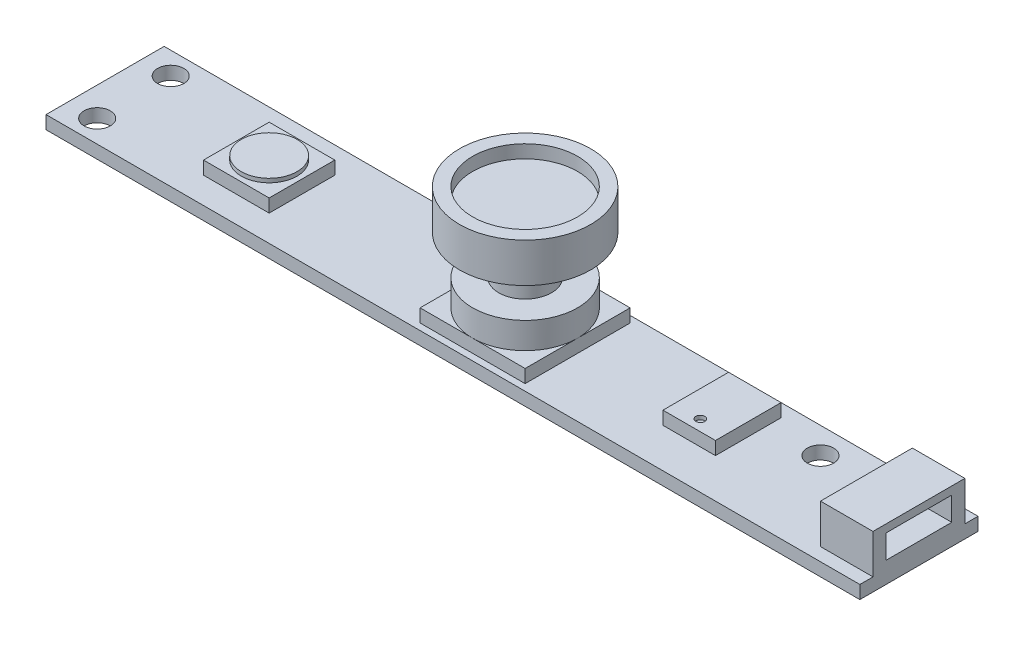
ISO-10303-21;
HEADER;
FILE_DESCRIPTION(('STEP AP214'),'2;1');
FILE_NAME('part.step','',(''),(''),'','','');
FILE_SCHEMA(('AUTOMOTIVE_DESIGN { 1 0 10303 214 1 1 1 1 }'));
ENDSEC;
DATA;
#1=APPLICATION_CONTEXT('core data for automotive mechanical design processes');
#2=APPLICATION_PROTOCOL_DEFINITION('international standard','automotive_design',2000,#1);
#3=PRODUCT_CONTEXT('',#1,'mechanical');
#4=PRODUCT('Part','Part','',(#3));
#5=PRODUCT_RELATED_PRODUCT_CATEGORY('part','',(#4));
#6=PRODUCT_DEFINITION_FORMATION('','',#4);
#7=PRODUCT_DEFINITION_CONTEXT('part definition',#1,'design');
#8=PRODUCT_DEFINITION('design','',#6,#7);
#9=PRODUCT_DEFINITION_SHAPE('','',#8);
#10=(LENGTH_UNIT() NAMED_UNIT(*) SI_UNIT(.MILLI.,.METRE.));
#11=(NAMED_UNIT(*) PLANE_ANGLE_UNIT() SI_UNIT($,.RADIAN.));
#12=(NAMED_UNIT(*) SI_UNIT($,.STERADIAN.) SOLID_ANGLE_UNIT());
#13=UNCERTAINTY_MEASURE_WITH_UNIT(LENGTH_MEASURE(1.E-05),#10,'distance_accuracy_value','');
#14=(GEOMETRIC_REPRESENTATION_CONTEXT(3) GLOBAL_UNCERTAINTY_ASSIGNED_CONTEXT((#13)) GLOBAL_UNIT_ASSIGNED_CONTEXT((#10,
#11,#12)) REPRESENTATION_CONTEXT('',''));
#15=CARTESIAN_POINT('',(0.,0.,0.));
#16=DIRECTION('',(0.,0.,1.));
#17=DIRECTION('',(1.,0.,0.));
#18=AXIS2_PLACEMENT_3D('',#15,#16,#17);
#19=CARTESIAN_POINT('',(0.,2.,0.));
#20=DIRECTION('',(0.,1.,0.));
#21=DIRECTION('',(0.,0.,1.));
#22=AXIS2_PLACEMENT_3D('',#19,#20,#21);
#23=PLANE('',#22);
#24=CARTESIAN_POINT('',(32.,2.,-4.5));
#25=DIRECTION('',(0.,1.,0.));
#26=DIRECTION('',(0.,0.,1.));
#27=AXIS2_PLACEMENT_3D('',#24,#25,#26);
#28=CIRCLE('',#27,4.);
#29=CARTESIAN_POINT('',(32.,2.,-0.500000000000003));
#30=VERTEX_POINT('',#29);
#31=CARTESIAN_POINT('',(36.,2.,-4.5));
#32=VERTEX_POINT('',#31);
#33=EDGE_CURVE('E234',#30,#32,#28,.T.);
#34=ORIENTED_EDGE('',*,*,#33,.F.);
#35=DIRECTION('',(1.,0.,0.));
#36=VECTOR('',#35,1.);
#37=CARTESIAN_POINT('',(0.,2.,-0.500000000000003));
#38=LINE('',#37,#36);
#39=CARTESIAN_POINT('',(36.,2.,-0.500000000000003));
#40=VERTEX_POINT('',#39);
#41=EDGE_CURVE('E221',#30,#40,#38,.T.);
#42=ORIENTED_EDGE('',*,*,#41,.T.);
#43=DIRECTION('',(0.,0.,-1.));
#44=VECTOR('',#43,1.);
#45=CARTESIAN_POINT('',(36.,2.,0.));
#46=LINE('',#45,#44);
#47=EDGE_CURVE('E235',#40,#32,#46,.T.);
#48=ORIENTED_EDGE('',*,*,#47,.T.);
#49=EDGE_LOOP('',(#34,#42,#48));
#50=FACE_BOUND('',#49,.T.);
#51=ADVANCED_FACE('F40',(#50),#23,.T.);
#52=CARTESIAN_POINT('',(32.,2.,-8.5));
#53=VERTEX_POINT('',#52);
#54=EDGE_CURVE('E49',#32,#53,#28,.T.);
#55=ORIENTED_EDGE('',*,*,#54,.F.);
#56=CARTESIAN_POINT('',(36.,2.,-8.5));
#57=VERTEX_POINT('',#56);
#58=EDGE_CURVE('E220',#32,#57,#46,.T.);
#59=ORIENTED_EDGE('',*,*,#58,.T.);
#60=DIRECTION('',(-1.,0.,0.));
#61=VECTOR('',#60,1.);
#62=CARTESIAN_POINT('',(0.,2.,-8.49999999999999));
#63=LINE('',#62,#61);
#64=EDGE_CURVE('E248',#57,#53,#63,.T.);
#65=ORIENTED_EDGE('',*,*,#64,.T.);
#66=EDGE_LOOP('',(#55,#59,#65));
#67=FACE_BOUND('',#66,.T.);
#68=ADVANCED_FACE('F496',(#67),#23,.T.);
#69=CARTESIAN_POINT('',(28.,2.,-4.5));
#70=VERTEX_POINT('',#69);
#71=EDGE_CURVE('E242',#53,#70,#28,.T.);
#72=ORIENTED_EDGE('',*,*,#71,.F.);
#73=CARTESIAN_POINT('',(28.,2.,-8.5));
#74=VERTEX_POINT('',#73);
#75=EDGE_CURVE('E250',#53,#74,#63,.T.);
#76=ORIENTED_EDGE('',*,*,#75,.T.);
#77=DIRECTION('',(0.,0.,1.));
#78=VECTOR('',#77,1.);
#79=CARTESIAN_POINT('',(28.,2.,0.));
#80=LINE('',#79,#78);
#81=EDGE_CURVE('E232',#74,#70,#80,.T.);
#82=ORIENTED_EDGE('',*,*,#81,.T.);
#83=EDGE_LOOP('',(#72,#76,#82));
#84=FACE_BOUND('',#83,.T.);
#85=ADVANCED_FACE('F501',(#84),#23,.T.);
#86=CARTESIAN_POINT('',(0.,1.,0.));
#87=DIRECTION('',(0.,-1.,0.));
#88=DIRECTION('',(0.,0.,-1.));
#89=AXIS2_PLACEMENT_3D('',#86,#87,#88);
#90=PLANE('',#89);
#91=DIRECTION('',(-1.,0.,0.));
#92=VECTOR('',#91,1.);
#93=CARTESIAN_POINT('',(0.,1.,-8.));
#94=LINE('',#93,#92);
#95=CARTESIAN_POINT('',(48.,1.,-8.));
#96=VERTEX_POINT('',#95);
#97=CARTESIAN_POINT('',(44.,1.,-8.));
#98=VERTEX_POINT('',#97);
#99=EDGE_CURVE('E310',#96,#98,#94,.T.);
#100=ORIENTED_EDGE('',*,*,#99,.F.);
#101=DIRECTION('',(0.,0.,1.));
#102=VECTOR('',#101,1.);
#103=CARTESIAN_POINT('',(48.,1.,0.));
#104=LINE('',#103,#102);
#105=CARTESIAN_POINT('',(48.,1.,-3.));
#106=VERTEX_POINT('',#105);
#107=EDGE_CURVE('E315',#96,#106,#104,.T.);
#108=ORIENTED_EDGE('',*,*,#107,.T.);
#109=DIRECTION('',(-1.,0.,0.));
#110=VECTOR('',#109,1.);
#111=CARTESIAN_POINT('',(0.,1.,-3.));
#112=LINE('',#111,#110);
#113=CARTESIAN_POINT('',(44.,1.,-3.));
#114=VERTEX_POINT('',#113);
#115=EDGE_CURVE('E329',#106,#114,#112,.T.);
#116=ORIENTED_EDGE('',*,*,#115,.T.);
#117=DIRECTION('',(0.,0.,1.));
#118=VECTOR('',#117,1.);
#119=CARTESIAN_POINT('',(44.,1.,0.));
#120=LINE('',#119,#118);
#121=EDGE_CURVE('E326',#98,#114,#120,.T.);
#122=ORIENTED_EDGE('',*,*,#121,.F.);
#123=EDGE_LOOP('',(#100,#108,#116,#122));
#124=FACE_BOUND('',#123,.T.);
#125=CARTESIAN_POINT('',(52.,1.,-7.));
#126=DIRECTION('',(0.,1.,0.));
#127=DIRECTION('',(0.,0.,1.));
#128=AXIS2_PLACEMENT_3D('',#125,#126,#127);
#129=CIRCLE('',#128,0.999999999999998);
#130=CARTESIAN_POINT('',(52.,1.,-6.));
#131=VERTEX_POINT('',#130);
#132=EDGE_CURVE('E342',#131,#131,#129,.T.);
#133=ORIENTED_EDGE('',*,*,#132,.F.);
#134=EDGE_LOOP('',(#133));
#135=FACE_BOUND('',#134,.T.);
#136=CARTESIAN_POINT('',(2.2,1.,-1.7));
#137=DIRECTION('',(0.,1.,0.));
#138=DIRECTION('',(0.,0.,1.));
#139=AXIS2_PLACEMENT_3D('',#136,#137,#138);
#140=CIRCLE('',#139,1.);
#141=CARTESIAN_POINT('',(2.2,1.,-0.699999999999999));
#142=VERTEX_POINT('',#141);
#143=EDGE_CURVE('E347',#142,#142,#140,.T.);
#144=ORIENTED_EDGE('',*,*,#143,.F.);
#145=EDGE_LOOP('',(#144));
#146=FACE_BOUND('',#145,.T.);
#147=CARTESIAN_POINT('',(2.2,1.,-7.3));
#148=DIRECTION('',(0.,1.,0.));
#149=DIRECTION('',(0.,0.,1.));
#150=AXIS2_PLACEMENT_3D('',#147,#148,#149);
#151=CIRCLE('',#150,1.);
#152=CARTESIAN_POINT('',(2.2,1.,-6.3));
#153=VERTEX_POINT('',#152);
#154=EDGE_CURVE('E346',#153,#153,#151,.T.);
#155=ORIENTED_EDGE('',*,*,#154,.F.);
#156=EDGE_LOOP('',(#155));
#157=FACE_BOUND('',#156,.T.);
#158=DIRECTION('',(1.,0.,0.));
#159=VECTOR('',#158,1.);
#160=CARTESIAN_POINT('',(58.,1.,-1.));
#161=LINE('',#160,#159);
#162=CARTESIAN_POINT('',(58.,1.,-1.));
#163=VERTEX_POINT('',#162);
#164=CARTESIAN_POINT('',(62.,1.,-1.));
#165=VERTEX_POINT('',#164);
#166=EDGE_CURVE('E396',#163,#165,#161,.T.);
#167=ORIENTED_EDGE('',*,*,#166,.F.);
#168=DIRECTION('',(0.,0.,1.));
#169=VECTOR('',#168,1.);
#170=CARTESIAN_POINT('',(58.,1.,-8.));
#171=LINE('',#170,#169);
#172=CARTESIAN_POINT('',(58.,1.,-8.));
#173=VERTEX_POINT('',#172);
#174=EDGE_CURVE('E405',#173,#163,#171,.T.);
#175=ORIENTED_EDGE('',*,*,#174,.F.);
#176=DIRECTION('',(-1.,0.,0.));
#177=VECTOR('',#176,1.);
#178=CARTESIAN_POINT('',(62.,1.,-8.));
#179=LINE('',#178,#177);
#180=CARTESIAN_POINT('',(62.,1.,-8.));
#181=VERTEX_POINT('',#180);
#182=EDGE_CURVE('E386',#181,#173,#179,.T.);
#183=ORIENTED_EDGE('',*,*,#182,.F.);
#184=DIRECTION('',(0.,0.,-1.));
#185=VECTOR('',#184,1.);
#186=CARTESIAN_POINT('',(62.,1.,0.));
#187=LINE('',#186,#185);
#188=CARTESIAN_POINT('',(62.,1.,-9.));
#189=VERTEX_POINT('',#188);
#190=EDGE_CURVE('E428',#181,#189,#187,.T.);
#191=ORIENTED_EDGE('',*,*,#190,.T.);
#192=DIRECTION('',(-1.,0.,0.));
#193=VECTOR('',#192,1.);
#194=CARTESIAN_POINT('',(0.,1.,-9.));
#195=LINE('',#194,#193);
#196=CARTESIAN_POINT('',(0.,1.,-9.));
#197=VERTEX_POINT('',#196);
#198=EDGE_CURVE('E431',#189,#197,#195,.T.);
#199=ORIENTED_EDGE('',*,*,#198,.T.);
#200=DIRECTION('',(0.,0.,1.));
#201=VECTOR('',#200,1.);
#202=CARTESIAN_POINT('',(0.,1.,0.));
#203=LINE('',#202,#201);
#204=CARTESIAN_POINT('',(0.,1.,0.));
#205=VERTEX_POINT('',#204);
#206=EDGE_CURVE('E422',#197,#205,#203,.T.);
#207=ORIENTED_EDGE('',*,*,#206,.T.);
#208=DIRECTION('',(1.,0.,0.));
#209=VECTOR('',#208,1.);
#210=CARTESIAN_POINT('',(0.,1.,0.));
#211=LINE('',#210,#209);
#212=CARTESIAN_POINT('',(62.,1.,0.));
#213=VERTEX_POINT('',#212);
#214=EDGE_CURVE('E425',#205,#213,#211,.T.);
#215=ORIENTED_EDGE('',*,*,#214,.T.);
#216=EDGE_CURVE('E429',#213,#165,#187,.T.);
#217=ORIENTED_EDGE('',*,*,#216,.T.);
#218=EDGE_LOOP('',(#167,#175,#183,#191,#199,#207,#215,#217));
#219=FACE_BOUND('',#218,.T.);
#220=DIRECTION('',(-1.,0.,0.));
#221=VECTOR('',#220,1.);
#222=CARTESIAN_POINT('',(0.,1.,-2.));
#223=LINE('',#222,#221);
#224=CARTESIAN_POINT('',(15.,1.,-2.));
#225=VERTEX_POINT('',#224);
#226=CARTESIAN_POINT('',(10.,1.,-2.));
#227=VERTEX_POINT('',#226);
#228=EDGE_CURVE('E294',#225,#227,#223,.T.);
#229=ORIENTED_EDGE('',*,*,#228,.T.);
#230=DIRECTION('',(0.,0.,-1.));
#231=VECTOR('',#230,1.);
#232=CARTESIAN_POINT('',(10.,1.,0.));
#233=LINE('',#232,#231);
#234=CARTESIAN_POINT('',(10.,1.,-7.));
#235=VERTEX_POINT('',#234);
#236=EDGE_CURVE('E276',#227,#235,#233,.T.);
#237=ORIENTED_EDGE('',*,*,#236,.T.);
#238=DIRECTION('',(1.,0.,0.));
#239=VECTOR('',#238,1.);
#240=CARTESIAN_POINT('',(0.,1.,-6.99999999999999));
#241=LINE('',#240,#239);
#242=CARTESIAN_POINT('',(15.,1.,-7.));
#243=VERTEX_POINT('',#242);
#244=EDGE_CURVE('E282',#235,#243,#241,.T.);
#245=ORIENTED_EDGE('',*,*,#244,.T.);
#246=DIRECTION('',(0.,0.,1.));
#247=VECTOR('',#246,1.);
#248=CARTESIAN_POINT('',(15.,1.,0.));
#249=LINE('',#248,#247);
#250=EDGE_CURVE('E297',#243,#225,#249,.T.);
#251=ORIENTED_EDGE('',*,*,#250,.T.);
#252=EDGE_LOOP('',(#229,#237,#245,#251));
#253=FACE_BOUND('',#252,.T.);
#254=DIRECTION('',(-1.,0.,0.));
#255=VECTOR('',#254,1.);
#256=CARTESIAN_POINT('',(0.,1.,-8.49999999999999));
#257=LINE('',#256,#255);
#258=CARTESIAN_POINT('',(36.,1.,-8.5));
#259=VERTEX_POINT('',#258);
#260=CARTESIAN_POINT('',(28.,1.,-8.5));
#261=VERTEX_POINT('',#260);
#262=EDGE_CURVE('E255',#259,#261,#257,.T.);
#263=ORIENTED_EDGE('',*,*,#262,.F.);
#264=DIRECTION('',(0.,0.,-1.));
#265=VECTOR('',#264,1.);
#266=CARTESIAN_POINT('',(36.,1.,0.));
#267=LINE('',#266,#265);
#268=CARTESIAN_POINT('',(36.,1.,-0.500000000000003));
#269=VERTEX_POINT('',#268);
#270=EDGE_CURVE('E263',#269,#259,#267,.T.);
#271=ORIENTED_EDGE('',*,*,#270,.F.);
#272=DIRECTION('',(1.,0.,0.));
#273=VECTOR('',#272,1.);
#274=CARTESIAN_POINT('',(0.,1.,-0.500000000000003));
#275=LINE('',#274,#273);
#276=CARTESIAN_POINT('',(28.,1.,-0.500000000000003));
#277=VERTEX_POINT('',#276);
#278=EDGE_CURVE('E261',#277,#269,#275,.T.);
#279=ORIENTED_EDGE('',*,*,#278,.F.);
#280=DIRECTION('',(0.,0.,1.));
#281=VECTOR('',#280,1.);
#282=CARTESIAN_POINT('',(28.,1.,0.));
#283=LINE('',#282,#281);
#284=EDGE_CURVE('E258',#261,#277,#283,.T.);
#285=ORIENTED_EDGE('',*,*,#284,.F.);
#286=EDGE_LOOP('',(#263,#271,#279,#285));
#287=FACE_BOUND('',#286,.T.);
#288=ADVANCED_FACE('F469',(#124,#135,#146,#157,#219,#253,#287),#90,.F.);
#289=CARTESIAN_POINT('',(0.,1.,0.));
#290=DIRECTION('',(1.,0.,0.));
#291=DIRECTION('',(0.,0.,-1.));
#292=AXIS2_PLACEMENT_3D('',#289,#290,#291);
#293=PLANE('',#292);
#294=DIRECTION('',(0.,0.,1.));
#295=VECTOR('',#294,1.);
#296=CARTESIAN_POINT('',(0.,0.,0.));
#297=LINE('',#296,#295);
#298=CARTESIAN_POINT('',(0.,0.,-9.));
#299=VERTEX_POINT('',#298);
#300=CARTESIAN_POINT('',(0.,0.,0.));
#301=VERTEX_POINT('',#300);
#302=EDGE_CURVE('E421',#299,#301,#297,.T.);
#303=ORIENTED_EDGE('',*,*,#302,.T.);
#304=DIRECTION('',(0.,-1.,0.));
#305=VECTOR('',#304,1.);
#306=CARTESIAN_POINT('',(0.,1.,0.));
#307=LINE('',#306,#305);
#308=EDGE_CURVE('E44',#205,#301,#307,.T.);
#309=ORIENTED_EDGE('',*,*,#308,.F.);
#310=ORIENTED_EDGE('',*,*,#206,.F.);
#311=DIRECTION('',(0.,-1.,0.));
#312=VECTOR('',#311,1.);
#313=CARTESIAN_POINT('',(0.,1.,-9.));
#314=LINE('',#313,#312);
#315=EDGE_CURVE('E433',#197,#299,#314,.T.);
#316=ORIENTED_EDGE('',*,*,#315,.T.);
#317=EDGE_LOOP('',(#303,#309,#310,#316));
#318=FACE_BOUND('',#317,.T.);
#319=ADVANCED_FACE('F42',(#318),#293,.F.);
#320=CARTESIAN_POINT('',(0.,1.,0.));
#321=DIRECTION('',(0.,0.,-1.));
#322=DIRECTION('',(-1.,0.,0.));
#323=AXIS2_PLACEMENT_3D('',#320,#321,#322);
#324=PLANE('',#323);
#325=DIRECTION('',(1.,0.,0.));
#326=VECTOR('',#325,1.);
#327=CARTESIAN_POINT('',(0.,0.,0.));
#328=LINE('',#327,#326);
#329=CARTESIAN_POINT('',(62.,0.,0.));
#330=VERTEX_POINT('',#329);
#331=EDGE_CURVE('E436',#301,#330,#328,.T.);
#332=ORIENTED_EDGE('',*,*,#331,.T.);
#333=DIRECTION('',(0.,-1.,0.));
#334=VECTOR('',#333,1.);
#335=CARTESIAN_POINT('',(62.,1.,0.));
#336=LINE('',#335,#334);
#337=EDGE_CURVE('E445',#213,#330,#336,.T.);
#338=ORIENTED_EDGE('',*,*,#337,.F.);
#339=ORIENTED_EDGE('',*,*,#214,.F.);
#340=ORIENTED_EDGE('',*,*,#308,.T.);
#341=EDGE_LOOP('',(#332,#338,#339,#340));
#342=FACE_BOUND('',#341,.T.);
#343=ADVANCED_FACE('F454',(#342),#324,.F.);
#344=CARTESIAN_POINT('',(62.,1.,0.));
#345=DIRECTION('',(-1.,0.,0.));
#346=DIRECTION('',(0.,0.,1.));
#347=AXIS2_PLACEMENT_3D('',#344,#345,#346);
#348=PLANE('',#347);
#349=DIRECTION('',(0.,0.,-1.));
#350=VECTOR('',#349,1.);
#351=CARTESIAN_POINT('',(62.,1.6,-2.));
#352=LINE('',#351,#350);
#353=CARTESIAN_POINT('',(62.,1.6,-2.));
#354=VERTEX_POINT('',#353);
#355=CARTESIAN_POINT('',(62.,1.6,-7.));
#356=VERTEX_POINT('',#355);
#357=EDGE_CURVE('E376',#354,#356,#352,.T.);
#358=ORIENTED_EDGE('',*,*,#357,.F.);
#359=DIRECTION('',(0.,-1.,0.));
#360=VECTOR('',#359,1.);
#361=CARTESIAN_POINT('',(62.,3.4,-2.));
#362=LINE('',#361,#360);
#363=CARTESIAN_POINT('',(62.,3.4,-2.));
#364=VERTEX_POINT('',#363);
#365=EDGE_CURVE('E358',#364,#354,#362,.T.);
#366=ORIENTED_EDGE('',*,*,#365,.F.);
#367=DIRECTION('',(0.,0.,1.));
#368=VECTOR('',#367,1.);
#369=CARTESIAN_POINT('',(62.,3.4,-2.));
#370=LINE('',#369,#368);
#371=CARTESIAN_POINT('',(62.,3.4,-7.));
#372=VERTEX_POINT('',#371);
#373=EDGE_CURVE('E365',#372,#364,#370,.T.);
#374=ORIENTED_EDGE('',*,*,#373,.F.);
#375=DIRECTION('',(0.,1.,0.));
#376=VECTOR('',#375,1.);
#377=CARTESIAN_POINT('',(62.,3.4,-7.));
#378=LINE('',#377,#376);
#379=EDGE_CURVE('E379',#356,#372,#378,.T.);
#380=ORIENTED_EDGE('',*,*,#379,.F.);
#381=EDGE_LOOP('',(#358,#366,#374,#380));
#382=FACE_BOUND('',#381,.T.);
#383=DIRECTION('',(0.,0.,-1.));
#384=VECTOR('',#383,1.);
#385=CARTESIAN_POINT('',(62.,0.,0.));
#386=LINE('',#385,#384);
#387=CARTESIAN_POINT('',(62.,0.,-9.));
#388=VERTEX_POINT('',#387);
#389=EDGE_CURVE('E438',#330,#388,#386,.T.);
#390=ORIENTED_EDGE('',*,*,#389,.T.);
#391=DIRECTION('',(0.,-1.,0.));
#392=VECTOR('',#391,1.);
#393=CARTESIAN_POINT('',(62.,1.,-9.));
#394=LINE('',#393,#392);
#395=EDGE_CURVE('E443',#189,#388,#394,.T.);
#396=ORIENTED_EDGE('',*,*,#395,.F.);
#397=ORIENTED_EDGE('',*,*,#190,.F.);
#398=DIRECTION('',(0.,-1.,0.));
#399=VECTOR('',#398,1.);
#400=CARTESIAN_POINT('',(62.,4.,-8.));
#401=LINE('',#400,#399);
#402=CARTESIAN_POINT('',(62.,4.,-8.));
#403=VERTEX_POINT('',#402);
#404=EDGE_CURVE('E418',#403,#181,#401,.T.);
#405=ORIENTED_EDGE('',*,*,#404,.F.);
#406=DIRECTION('',(0.,0.,-1.));
#407=VECTOR('',#406,1.);
#408=CARTESIAN_POINT('',(62.,4.,-4.5));
#409=LINE('',#408,#407);
#410=CARTESIAN_POINT('',(62.,4.,-1.));
#411=VERTEX_POINT('',#410);
#412=EDGE_CURVE('E393',#411,#403,#409,.T.);
#413=ORIENTED_EDGE('',*,*,#412,.F.);
#414=DIRECTION('',(0.,-1.,0.));
#415=VECTOR('',#414,1.);
#416=CARTESIAN_POINT('',(62.,4.,-1.));
#417=LINE('',#416,#415);
#418=EDGE_CURVE('E402',#411,#165,#417,.T.);
#419=ORIENTED_EDGE('',*,*,#418,.T.);
#420=ORIENTED_EDGE('',*,*,#216,.F.);
#421=ORIENTED_EDGE('',*,*,#337,.T.);
#422=EDGE_LOOP('',(#390,#396,#397,#405,#413,#419,#420,#421));
#423=FACE_BOUND('',#422,.T.);
#424=ADVANCED_FACE('F463',(#382,#423),#348,.F.);
#425=CARTESIAN_POINT('',(0.,1.,-9.));
#426=DIRECTION('',(0.,0.,1.));
#427=DIRECTION('',(1.,0.,0.));
#428=AXIS2_PLACEMENT_3D('',#425,#426,#427);
#429=PLANE('',#428);
#430=DIRECTION('',(-1.,0.,0.));
#431=VECTOR('',#430,1.);
#432=CARTESIAN_POINT('',(0.,0.,-9.));
#433=LINE('',#432,#431);
#434=EDGE_CURVE('E426',#388,#299,#433,.T.);
#435=ORIENTED_EDGE('',*,*,#434,.T.);
#436=ORIENTED_EDGE('',*,*,#315,.F.);
#437=ORIENTED_EDGE('',*,*,#198,.F.);
#438=ORIENTED_EDGE('',*,*,#395,.T.);
#439=EDGE_LOOP('',(#435,#436,#437,#438));
#440=FACE_BOUND('',#439,.T.);
#441=ADVANCED_FACE('F467',(#440),#429,.F.);
#442=CARTESIAN_POINT('',(0.,0.,0.));
#443=DIRECTION('',(0.,-1.,0.));
#444=DIRECTION('',(0.,0.,-1.));
#445=AXIS2_PLACEMENT_3D('',#442,#443,#444);
#446=PLANE('',#445);
#447=CARTESIAN_POINT('',(52.,0.,-7.));
#448=DIRECTION('',(0.,1.,0.));
#449=DIRECTION('',(0.,0.,1.));
#450=AXIS2_PLACEMENT_3D('',#447,#448,#449);
#451=CIRCLE('',#450,0.999999999999998);
#452=CARTESIAN_POINT('',(52.,0.,-6.));
#453=VERTEX_POINT('',#452);
#454=EDGE_CURVE('E350',#453,#453,#451,.T.);
#455=ORIENTED_EDGE('',*,*,#454,.T.);
#456=EDGE_LOOP('',(#455));
#457=FACE_BOUND('',#456,.T.);
#458=CARTESIAN_POINT('',(2.2,0.,-1.7));
#459=DIRECTION('',(0.,1.,0.));
#460=DIRECTION('',(0.,0.,1.));
#461=AXIS2_PLACEMENT_3D('',#458,#459,#460);
#462=CIRCLE('',#461,1.);
#463=CARTESIAN_POINT('',(2.2,0.,-0.699999999999999));
#464=VERTEX_POINT('',#463);
#465=EDGE_CURVE('E343',#464,#464,#462,.T.);
#466=ORIENTED_EDGE('',*,*,#465,.T.);
#467=EDGE_LOOP('',(#466));
#468=FACE_BOUND('',#467,.T.);
#469=CARTESIAN_POINT('',(2.2,0.,-7.3));
#470=DIRECTION('',(0.,1.,0.));
#471=DIRECTION('',(0.,0.,1.));
#472=AXIS2_PLACEMENT_3D('',#469,#470,#471);
#473=CIRCLE('',#472,1.);
#474=CARTESIAN_POINT('',(2.2,0.,-6.3));
#475=VERTEX_POINT('',#474);
#476=EDGE_CURVE('E355',#475,#475,#473,.T.);
#477=ORIENTED_EDGE('',*,*,#476,.T.);
#478=EDGE_LOOP('',(#477));
#479=FACE_BOUND('',#478,.T.);
#480=ORIENTED_EDGE('',*,*,#302,.F.);
#481=ORIENTED_EDGE('',*,*,#434,.F.);
#482=ORIENTED_EDGE('',*,*,#389,.F.);
#483=ORIENTED_EDGE('',*,*,#331,.F.);
#484=EDGE_LOOP('',(#480,#481,#482,#483));
#485=FACE_BOUND('',#484,.T.);
#486=ADVANCED_FACE('F461',(#457,#468,#479,#485),#446,.T.);
#487=CARTESIAN_POINT('',(62.,4.,-8.));
#488=DIRECTION('',(0.,0.,1.));
#489=DIRECTION('',(1.,0.,0.));
#490=AXIS2_PLACEMENT_3D('',#487,#488,#489);
#491=PLANE('',#490);
#492=ORIENTED_EDGE('',*,*,#182,.T.);
#493=DIRECTION('',(0.,-1.,0.));
#494=VECTOR('',#493,1.);
#495=CARTESIAN_POINT('',(58.,4.,-8.));
#496=LINE('',#495,#494);
#497=CARTESIAN_POINT('',(58.,4.,-8.));
#498=VERTEX_POINT('',#497);
#499=EDGE_CURVE('E415',#498,#173,#496,.T.);
#500=ORIENTED_EDGE('',*,*,#499,.F.);
#501=DIRECTION('',(-1.,0.,0.));
#502=VECTOR('',#501,1.);
#503=CARTESIAN_POINT('',(62.,4.,-8.));
#504=LINE('',#503,#502);
#505=EDGE_CURVE('E395',#403,#498,#504,.T.);
#506=ORIENTED_EDGE('',*,*,#505,.F.);
#507=ORIENTED_EDGE('',*,*,#404,.T.);
#508=EDGE_LOOP('',(#492,#500,#506,#507));
#509=FACE_BOUND('',#508,.T.);
#510=ADVANCED_FACE('F475',(#509),#491,.F.);
#511=CARTESIAN_POINT('',(58.,4.,-8.));
#512=DIRECTION('',(1.,0.,0.));
#513=DIRECTION('',(0.,0.,-1.));
#514=AXIS2_PLACEMENT_3D('',#511,#512,#513);
#515=PLANE('',#514);
#516=ORIENTED_EDGE('',*,*,#174,.T.);
#517=DIRECTION('',(0.,-1.,0.));
#518=VECTOR('',#517,1.);
#519=CARTESIAN_POINT('',(58.,4.,-1.));
#520=LINE('',#519,#518);
#521=CARTESIAN_POINT('',(58.,4.,-1.));
#522=VERTEX_POINT('',#521);
#523=EDGE_CURVE('E412',#522,#163,#520,.T.);
#524=ORIENTED_EDGE('',*,*,#523,.F.);
#525=DIRECTION('',(0.,0.,1.));
#526=VECTOR('',#525,1.);
#527=CARTESIAN_POINT('',(58.,4.,-8.));
#528=LINE('',#527,#526);
#529=EDGE_CURVE('E398',#498,#522,#528,.T.);
#530=ORIENTED_EDGE('',*,*,#529,.F.);
#531=ORIENTED_EDGE('',*,*,#499,.T.);
#532=EDGE_LOOP('',(#516,#524,#530,#531));
#533=FACE_BOUND('',#532,.T.);
#534=ADVANCED_FACE('F486',(#533),#515,.F.);
#535=CARTESIAN_POINT('',(58.,4.,-1.));
#536=DIRECTION('',(0.,0.,-1.));
#537=DIRECTION('',(-1.,0.,0.));
#538=AXIS2_PLACEMENT_3D('',#535,#536,#537);
#539=PLANE('',#538);
#540=ORIENTED_EDGE('',*,*,#166,.T.);
#541=ORIENTED_EDGE('',*,*,#418,.F.);
#542=DIRECTION('',(1.,0.,0.));
#543=VECTOR('',#542,1.);
#544=CARTESIAN_POINT('',(58.,4.,-1.));
#545=LINE('',#544,#543);
#546=EDGE_CURVE('E400',#522,#411,#545,.T.);
#547=ORIENTED_EDGE('',*,*,#546,.F.);
#548=ORIENTED_EDGE('',*,*,#523,.T.);
#549=EDGE_LOOP('',(#540,#541,#547,#548));
#550=FACE_BOUND('',#549,.T.);
#551=ADVANCED_FACE('F484',(#550),#539,.F.);
#552=CARTESIAN_POINT('',(0.,4.,0.));
#553=DIRECTION('',(0.,1.,0.));
#554=DIRECTION('',(0.,0.,1.));
#555=AXIS2_PLACEMENT_3D('',#552,#553,#554);
#556=PLANE('',#555);
#557=ORIENTED_EDGE('',*,*,#412,.T.);
#558=ORIENTED_EDGE('',*,*,#505,.T.);
#559=ORIENTED_EDGE('',*,*,#529,.T.);
#560=ORIENTED_EDGE('',*,*,#546,.T.);
#561=EDGE_LOOP('',(#557,#558,#559,#560));
#562=FACE_BOUND('',#561,.T.);
#563=ADVANCED_FACE('F479',(#562),#556,.T.);
#564=CARTESIAN_POINT('',(59.,3.4,-2.));
#565=DIRECTION('',(0.,0.,1.));
#566=DIRECTION('',(1.,0.,0.));
#567=AXIS2_PLACEMENT_3D('',#564,#565,#566);
#568=PLANE('',#567);
#569=ORIENTED_EDGE('',*,*,#365,.T.);
#570=DIRECTION('',(1.,0.,0.));
#571=VECTOR('',#570,1.);
#572=CARTESIAN_POINT('',(59.,1.6,-2.));
#573=LINE('',#572,#571);
#574=CARTESIAN_POINT('',(59.,1.6,-2.));
#575=VERTEX_POINT('',#574);
#576=EDGE_CURVE('E374',#575,#354,#573,.T.);
#577=ORIENTED_EDGE('',*,*,#576,.F.);
#578=DIRECTION('',(0.,-1.,0.));
#579=VECTOR('',#578,1.);
#580=CARTESIAN_POINT('',(59.,3.4,-2.));
#581=LINE('',#580,#579);
#582=CARTESIAN_POINT('',(59.,3.4,-2.));
#583=VERTEX_POINT('',#582);
#584=EDGE_CURVE('E361',#583,#575,#581,.T.);
#585=ORIENTED_EDGE('',*,*,#584,.F.);
#586=DIRECTION('',(1.,0.,0.));
#587=VECTOR('',#586,1.);
#588=CARTESIAN_POINT('',(59.,3.4,-2.));
#589=LINE('',#588,#587);
#590=EDGE_CURVE('E384',#583,#364,#589,.T.);
#591=ORIENTED_EDGE('',*,*,#590,.T.);
#592=EDGE_LOOP('',(#569,#577,#585,#591));
#593=FACE_BOUND('',#592,.T.);
#594=ADVANCED_FACE('F608',(#593),#568,.F.);
#595=CARTESIAN_POINT('',(59.,3.4,-2.));
#596=DIRECTION('',(0.,1.,0.));
#597=DIRECTION('',(0.,0.,1.));
#598=AXIS2_PLACEMENT_3D('',#595,#596,#597);
#599=PLANE('',#598);
#600=ORIENTED_EDGE('',*,*,#373,.T.);
#601=ORIENTED_EDGE('',*,*,#590,.F.);
#602=DIRECTION('',(0.,0.,1.));
#603=VECTOR('',#602,1.);
#604=CARTESIAN_POINT('',(59.,3.4,-2.));
#605=LINE('',#604,#603);
#606=CARTESIAN_POINT('',(59.,3.4,-7.));
#607=VERTEX_POINT('',#606);
#608=EDGE_CURVE('E371',#607,#583,#605,.T.);
#609=ORIENTED_EDGE('',*,*,#608,.F.);
#610=DIRECTION('',(1.,0.,0.));
#611=VECTOR('',#610,1.);
#612=CARTESIAN_POINT('',(59.,3.4,-7.));
#613=LINE('',#612,#611);
#614=EDGE_CURVE('E387',#607,#372,#613,.T.);
#615=ORIENTED_EDGE('',*,*,#614,.T.);
#616=EDGE_LOOP('',(#600,#601,#609,#615));
#617=FACE_BOUND('',#616,.T.);
#618=ADVANCED_FACE('F604',(#617),#599,.F.);
#619=CARTESIAN_POINT('',(59.,3.4,-7.));
#620=DIRECTION('',(0.,0.,-1.));
#621=DIRECTION('',(-1.,0.,0.));
#622=AXIS2_PLACEMENT_3D('',#619,#620,#621);
#623=PLANE('',#622);
#624=ORIENTED_EDGE('',*,*,#379,.T.);
#625=ORIENTED_EDGE('',*,*,#614,.F.);
#626=DIRECTION('',(0.,1.,0.));
#627=VECTOR('',#626,1.);
#628=CARTESIAN_POINT('',(59.,3.4,-7.));
#629=LINE('',#628,#627);
#630=CARTESIAN_POINT('',(59.,1.6,-7.));
#631=VERTEX_POINT('',#630);
#632=EDGE_CURVE('E368',#631,#607,#629,.T.);
#633=ORIENTED_EDGE('',*,*,#632,.F.);
#634=DIRECTION('',(1.,0.,0.));
#635=VECTOR('',#634,1.);
#636=CARTESIAN_POINT('',(59.,1.6,-7.));
#637=LINE('',#636,#635);
#638=EDGE_CURVE('E389',#631,#356,#637,.T.);
#639=ORIENTED_EDGE('',*,*,#638,.T.);
#640=EDGE_LOOP('',(#624,#625,#633,#639));
#641=FACE_BOUND('',#640,.T.);
#642=ADVANCED_FACE('F607',(#641),#623,.F.);
#643=CARTESIAN_POINT('',(59.,1.6,-2.));
#644=DIRECTION('',(0.,-1.,0.));
#645=DIRECTION('',(0.,0.,-1.));
#646=AXIS2_PLACEMENT_3D('',#643,#644,#645);
#647=PLANE('',#646);
#648=ORIENTED_EDGE('',*,*,#357,.T.);
#649=ORIENTED_EDGE('',*,*,#638,.F.);
#650=DIRECTION('',(0.,0.,-1.));
#651=VECTOR('',#650,1.);
#652=CARTESIAN_POINT('',(59.,1.6,-2.));
#653=LINE('',#652,#651);
#654=EDGE_CURVE('E364',#575,#631,#653,.T.);
#655=ORIENTED_EDGE('',*,*,#654,.F.);
#656=ORIENTED_EDGE('',*,*,#576,.T.);
#657=EDGE_LOOP('',(#648,#649,#655,#656));
#658=FACE_BOUND('',#657,.T.);
#659=ADVANCED_FACE('F602',(#658),#647,.F.);
#660=CARTESIAN_POINT('',(59.,0.,0.));
#661=DIRECTION('',(1.,0.,0.));
#662=DIRECTION('',(0.,0.,-1.));
#663=AXIS2_PLACEMENT_3D('',#660,#661,#662);
#664=PLANE('',#663);
#665=ORIENTED_EDGE('',*,*,#584,.T.);
#666=ORIENTED_EDGE('',*,*,#654,.T.);
#667=ORIENTED_EDGE('',*,*,#632,.T.);
#668=ORIENTED_EDGE('',*,*,#608,.T.);
#669=EDGE_LOOP('',(#665,#666,#667,#668));
#670=FACE_BOUND('',#669,.T.);
#671=ADVANCED_FACE('F598',(#670),#664,.T.);
#672=CARTESIAN_POINT('',(2.2,0.,-7.3));
#673=DIRECTION('',(0.,1.,0.));
#674=DIRECTION('',(0.,0.,1.));
#675=AXIS2_PLACEMENT_3D('',#672,#673,#674);
#676=CYLINDRICAL_SURFACE('',#675,1.);
#677=ORIENTED_EDGE('',*,*,#476,.F.);
#678=EDGE_LOOP('',(#677));
#679=FACE_BOUND('',#678,.T.);
#680=ORIENTED_EDGE('',*,*,#154,.T.);
#681=EDGE_LOOP('',(#680));
#682=FACE_BOUND('',#681,.T.);
#683=ADVANCED_FACE('F591',(#679,#682),#676,.F.);
#684=CARTESIAN_POINT('',(2.2,0.,-1.7));
#685=DIRECTION('',(0.,1.,0.));
#686=DIRECTION('',(0.,0.,1.));
#687=AXIS2_PLACEMENT_3D('',#684,#685,#686);
#688=CYLINDRICAL_SURFACE('',#687,1.);
#689=ORIENTED_EDGE('',*,*,#465,.F.);
#690=EDGE_LOOP('',(#689));
#691=FACE_BOUND('',#690,.T.);
#692=ORIENTED_EDGE('',*,*,#143,.T.);
#693=EDGE_LOOP('',(#692));
#694=FACE_BOUND('',#693,.T.);
#695=ADVANCED_FACE('F588',(#691,#694),#688,.F.);
#696=CARTESIAN_POINT('',(52.,0.,-7.));
#697=DIRECTION('',(0.,1.,0.));
#698=DIRECTION('',(0.,0.,1.));
#699=AXIS2_PLACEMENT_3D('',#696,#697,#698);
#700=CYLINDRICAL_SURFACE('',#699,0.999999999999998);
#701=ORIENTED_EDGE('',*,*,#454,.F.);
#702=EDGE_LOOP('',(#701));
#703=FACE_BOUND('',#702,.T.);
#704=ORIENTED_EDGE('',*,*,#132,.T.);
#705=EDGE_LOOP('',(#704));
#706=FACE_BOUND('',#705,.T.);
#707=ADVANCED_FACE('F586',(#703,#706),#700,.F.);
#708=CARTESIAN_POINT('',(0.,2.,-8.));
#709=DIRECTION('',(0.,0.,1.));
#710=DIRECTION('',(1.,0.,0.));
#711=AXIS2_PLACEMENT_3D('',#708,#709,#710);
#712=PLANE('',#711);
#713=ORIENTED_EDGE('',*,*,#99,.T.);
#714=DIRECTION('',(0.,-1.,0.));
#715=VECTOR('',#714,1.);
#716=CARTESIAN_POINT('',(44.,2.,-8.));
#717=LINE('',#716,#715);
#718=CARTESIAN_POINT('',(44.,2.,-8.));
#719=VERTEX_POINT('',#718);
#720=EDGE_CURVE('E340',#719,#98,#717,.T.);
#721=ORIENTED_EDGE('',*,*,#720,.F.);
#722=DIRECTION('',(-1.,0.,0.));
#723=VECTOR('',#722,1.);
#724=CARTESIAN_POINT('',(0.,2.,-8.));
#725=LINE('',#724,#723);
#726=CARTESIAN_POINT('',(48.,2.,-8.));
#727=VERTEX_POINT('',#726);
#728=EDGE_CURVE('E311',#727,#719,#725,.T.);
#729=ORIENTED_EDGE('',*,*,#728,.F.);
#730=DIRECTION('',(0.,-1.,0.));
#731=VECTOR('',#730,1.);
#732=CARTESIAN_POINT('',(48.,2.,-8.));
#733=LINE('',#732,#731);
#734=EDGE_CURVE('E323',#727,#96,#733,.T.);
#735=ORIENTED_EDGE('',*,*,#734,.T.);
#736=EDGE_LOOP('',(#713,#721,#729,#735));
#737=FACE_BOUND('',#736,.T.);
#738=ADVANCED_FACE('F582',(#737),#712,.F.);
#739=CARTESIAN_POINT('',(44.,2.,0.));
#740=DIRECTION('',(1.,0.,0.));
#741=DIRECTION('',(0.,0.,-1.));
#742=AXIS2_PLACEMENT_3D('',#739,#740,#741);
#743=PLANE('',#742);
#744=ORIENTED_EDGE('',*,*,#121,.T.);
#745=DIRECTION('',(0.,-1.,0.));
#746=VECTOR('',#745,1.);
#747=CARTESIAN_POINT('',(44.,2.,-3.));
#748=LINE('',#747,#746);
#749=CARTESIAN_POINT('',(44.,2.,-3.));
#750=VERTEX_POINT('',#749);
#751=EDGE_CURVE('E338',#750,#114,#748,.T.);
#752=ORIENTED_EDGE('',*,*,#751,.F.);
#753=DIRECTION('',(0.,0.,1.));
#754=VECTOR('',#753,1.);
#755=CARTESIAN_POINT('',(44.,2.,0.));
#756=LINE('',#755,#754);
#757=EDGE_CURVE('E314',#719,#750,#756,.T.);
#758=ORIENTED_EDGE('',*,*,#757,.F.);
#759=ORIENTED_EDGE('',*,*,#720,.T.);
#760=EDGE_LOOP('',(#744,#752,#758,#759));
#761=FACE_BOUND('',#760,.T.);
#762=ADVANCED_FACE('F578',(#761),#743,.F.);
#763=CARTESIAN_POINT('',(0.,2.,-3.));
#764=DIRECTION('',(0.,0.,1.));
#765=DIRECTION('',(1.,0.,0.));
#766=AXIS2_PLACEMENT_3D('',#763,#764,#765);
#767=PLANE('',#766);
#768=ORIENTED_EDGE('',*,*,#115,.F.);
#769=DIRECTION('',(0.,-1.,0.));
#770=VECTOR('',#769,1.);
#771=CARTESIAN_POINT('',(48.,2.,-3.));
#772=LINE('',#771,#770);
#773=CARTESIAN_POINT('',(48.,2.,-3.));
#774=VERTEX_POINT('',#773);
#775=EDGE_CURVE('E335',#774,#106,#772,.T.);
#776=ORIENTED_EDGE('',*,*,#775,.F.);
#777=DIRECTION('',(-1.,0.,0.));
#778=VECTOR('',#777,1.);
#779=CARTESIAN_POINT('',(0.,2.,-3.));
#780=LINE('',#779,#778);
#781=EDGE_CURVE('E317',#774,#750,#780,.T.);
#782=ORIENTED_EDGE('',*,*,#781,.T.);
#783=ORIENTED_EDGE('',*,*,#751,.T.);
#784=EDGE_LOOP('',(#768,#776,#782,#783));
#785=FACE_BOUND('',#784,.T.);
#786=ADVANCED_FACE('F574',(#785),#767,.T.);
#787=CARTESIAN_POINT('',(48.,2.,0.));
#788=DIRECTION('',(1.,0.,0.));
#789=DIRECTION('',(0.,0.,-1.));
#790=AXIS2_PLACEMENT_3D('',#787,#788,#789);
#791=PLANE('',#790);
#792=ORIENTED_EDGE('',*,*,#107,.F.);
#793=ORIENTED_EDGE('',*,*,#734,.F.);
#794=DIRECTION('',(0.,0.,1.));
#795=VECTOR('',#794,1.);
#796=CARTESIAN_POINT('',(48.,2.,0.));
#797=LINE('',#796,#795);
#798=EDGE_CURVE('E320',#727,#774,#797,.T.);
#799=ORIENTED_EDGE('',*,*,#798,.T.);
#800=ORIENTED_EDGE('',*,*,#775,.T.);
#801=EDGE_LOOP('',(#792,#793,#799,#800));
#802=FACE_BOUND('',#801,.T.);
#803=ADVANCED_FACE('F570',(#802),#791,.T.);
#804=CARTESIAN_POINT('',(0.,2.,0.));
#805=DIRECTION('',(0.,1.,0.));
#806=DIRECTION('',(0.,0.,1.));
#807=AXIS2_PLACEMENT_3D('',#804,#805,#806);
#808=PLANE('',#807);
#809=CARTESIAN_POINT('',(46.,2.,-3.84547861625883));
#810=DIRECTION('',(0.,1.,0.));
#811=DIRECTION('',(0.,0.,1.));
#812=AXIS2_PLACEMENT_3D('',#809,#810,#811);
#813=CIRCLE('',#812,0.34111046374567);
#814=CARTESIAN_POINT('',(46.,2.,-3.50436815251316));
#815=VERTEX_POINT('',#814);
#816=EDGE_CURVE('E841',#815,#815,#813,.T.);
#817=ORIENTED_EDGE('',*,*,#816,.F.);
#818=EDGE_LOOP('',(#817));
#819=FACE_BOUND('',#818,.T.);
#820=ORIENTED_EDGE('',*,*,#728,.T.);
#821=ORIENTED_EDGE('',*,*,#757,.T.);
#822=ORIENTED_EDGE('',*,*,#781,.F.);
#823=ORIENTED_EDGE('',*,*,#798,.F.);
#824=EDGE_LOOP('',(#820,#821,#822,#823));
#825=FACE_BOUND('',#824,.T.);
#826=ADVANCED_FACE('F566',(#819,#825),#808,.T.);
#827=CARTESIAN_POINT('',(10.,2.,0.));
#828=DIRECTION('',(-1.,0.,0.));
#829=DIRECTION('',(0.,0.,1.));
#830=AXIS2_PLACEMENT_3D('',#827,#828,#829);
#831=PLANE('',#830);
#832=ORIENTED_EDGE('',*,*,#236,.F.);
#833=DIRECTION('',(0.,-1.,0.));
#834=VECTOR('',#833,1.);
#835=CARTESIAN_POINT('',(10.,2.,-2.));
#836=LINE('',#835,#834);
#837=CARTESIAN_POINT('',(10.,2.,-2.));
#838=VERTEX_POINT('',#837);
#839=EDGE_CURVE('E308',#838,#227,#836,.T.);
#840=ORIENTED_EDGE('',*,*,#839,.F.);
#841=DIRECTION('',(0.,0.,-1.));
#842=VECTOR('',#841,1.);
#843=CARTESIAN_POINT('',(10.,2.,0.));
#844=LINE('',#843,#842);
#845=CARTESIAN_POINT('',(10.,2.,-7.));
#846=VERTEX_POINT('',#845);
#847=EDGE_CURVE('E278',#838,#846,#844,.T.);
#848=ORIENTED_EDGE('',*,*,#847,.T.);
#849=DIRECTION('',(0.,-1.,0.));
#850=VECTOR('',#849,1.);
#851=CARTESIAN_POINT('',(10.,2.,-7.));
#852=LINE('',#851,#850);
#853=EDGE_CURVE('E291',#846,#235,#852,.T.);
#854=ORIENTED_EDGE('',*,*,#853,.T.);
#855=EDGE_LOOP('',(#832,#840,#848,#854));
#856=FACE_BOUND('',#855,.T.);
#857=ADVANCED_FACE('F562',(#856),#831,.T.);
#858=CARTESIAN_POINT('',(0.,2.,-2.));
#859=DIRECTION('',(0.,0.,1.));
#860=DIRECTION('',(1.,0.,0.));
#861=AXIS2_PLACEMENT_3D('',#858,#859,#860);
#862=PLANE('',#861);
#863=ORIENTED_EDGE('',*,*,#228,.F.);
#864=DIRECTION('',(0.,-1.,0.));
#865=VECTOR('',#864,1.);
#866=CARTESIAN_POINT('',(15.,2.,-2.));
#867=LINE('',#866,#865);
#868=CARTESIAN_POINT('',(15.,2.,-2.));
#869=VERTEX_POINT('',#868);
#870=EDGE_CURVE('E306',#869,#225,#867,.T.);
#871=ORIENTED_EDGE('',*,*,#870,.F.);
#872=DIRECTION('',(-1.,0.,0.));
#873=VECTOR('',#872,1.);
#874=CARTESIAN_POINT('',(0.,2.,-2.));
#875=LINE('',#874,#873);
#876=EDGE_CURVE('E281',#869,#838,#875,.T.);
#877=ORIENTED_EDGE('',*,*,#876,.T.);
#878=ORIENTED_EDGE('',*,*,#839,.T.);
#879=EDGE_LOOP('',(#863,#871,#877,#878));
#880=FACE_BOUND('',#879,.T.);
#881=ADVANCED_FACE('F558',(#880),#862,.T.);
#882=CARTESIAN_POINT('',(15.,2.,0.));
#883=DIRECTION('',(1.,0.,0.));
#884=DIRECTION('',(0.,0.,-1.));
#885=AXIS2_PLACEMENT_3D('',#882,#883,#884);
#886=PLANE('',#885);
#887=ORIENTED_EDGE('',*,*,#250,.F.);
#888=DIRECTION('',(0.,-1.,0.));
#889=VECTOR('',#888,1.);
#890=CARTESIAN_POINT('',(15.,2.,-7.));
#891=LINE('',#890,#889);
#892=CARTESIAN_POINT('',(15.,2.,-7.));
#893=VERTEX_POINT('',#892);
#894=EDGE_CURVE('E303',#893,#243,#891,.T.);
#895=ORIENTED_EDGE('',*,*,#894,.F.);
#896=DIRECTION('',(0.,0.,1.));
#897=VECTOR('',#896,1.);
#898=CARTESIAN_POINT('',(15.,2.,0.));
#899=LINE('',#898,#897);
#900=EDGE_CURVE('E285',#893,#869,#899,.T.);
#901=ORIENTED_EDGE('',*,*,#900,.T.);
#902=ORIENTED_EDGE('',*,*,#870,.T.);
#903=EDGE_LOOP('',(#887,#895,#901,#902));
#904=FACE_BOUND('',#903,.T.);
#905=ADVANCED_FACE('F554',(#904),#886,.T.);
#906=CARTESIAN_POINT('',(0.,2.,-6.99999999999999));
#907=DIRECTION('',(0.,0.,-1.));
#908=DIRECTION('',(-1.,0.,0.));
#909=AXIS2_PLACEMENT_3D('',#906,#907,#908);
#910=PLANE('',#909);
#911=ORIENTED_EDGE('',*,*,#244,.F.);
#912=ORIENTED_EDGE('',*,*,#853,.F.);
#913=DIRECTION('',(1.,0.,0.));
#914=VECTOR('',#913,1.);
#915=CARTESIAN_POINT('',(0.,2.,-6.99999999999999));
#916=LINE('',#915,#914);
#917=EDGE_CURVE('E288',#846,#893,#916,.T.);
#918=ORIENTED_EDGE('',*,*,#917,.T.);
#919=ORIENTED_EDGE('',*,*,#894,.T.);
#920=EDGE_LOOP('',(#911,#912,#918,#919));
#921=FACE_BOUND('',#920,.T.);
#922=ADVANCED_FACE('F550',(#921),#910,.T.);
#923=CARTESIAN_POINT('',(0.,2.,0.));
#924=DIRECTION('',(0.,1.,0.));
#925=DIRECTION('',(0.,0.,1.));
#926=AXIS2_PLACEMENT_3D('',#923,#924,#925);
#927=PLANE('',#926);
#928=CARTESIAN_POINT('',(12.5,2.,-4.5));
#929=DIRECTION('',(0.,1.,0.));
#930=DIRECTION('',(0.,0.,1.));
#931=AXIS2_PLACEMENT_3D('',#928,#929,#930);
#932=CIRCLE('',#931,2.12597331230642);
#933=CARTESIAN_POINT('',(12.5,2.,-2.37402668769358));
#934=VERTEX_POINT('',#933);
#935=EDGE_CURVE('E243',#934,#934,#932,.T.);
#936=ORIENTED_EDGE('',*,*,#935,.F.);
#937=EDGE_LOOP('',(#936));
#938=FACE_BOUND('',#937,.T.);
#939=ORIENTED_EDGE('',*,*,#847,.F.);
#940=ORIENTED_EDGE('',*,*,#876,.F.);
#941=ORIENTED_EDGE('',*,*,#900,.F.);
#942=ORIENTED_EDGE('',*,*,#917,.F.);
#943=EDGE_LOOP('',(#939,#940,#941,#942));
#944=FACE_BOUND('',#943,.T.);
#945=ADVANCED_FACE('F546',(#938,#944),#927,.T.);
#946=CARTESIAN_POINT('',(12.5,2.3,-4.5));
#947=DIRECTION('',(0.,-1.,0.));
#948=DIRECTION('',(0.,0.,-1.));
#949=AXIS2_PLACEMENT_3D('',#946,#947,#948);
#950=CYLINDRICAL_SURFACE('',#949,2.12597331230642);
#951=CARTESIAN_POINT('',(12.5,2.3,-4.5));
#952=DIRECTION('',(0.,1.,0.));
#953=DIRECTION('',(0.,0.,1.));
#954=AXIS2_PLACEMENT_3D('',#951,#952,#953);
#955=CIRCLE('',#954,2.12597331230642);
#956=CARTESIAN_POINT('',(12.5,2.3,-2.37402668769358));
#957=VERTEX_POINT('',#956);
#958=EDGE_CURVE('E274',#957,#957,#955,.T.);
#959=ORIENTED_EDGE('',*,*,#958,.F.);
#960=EDGE_LOOP('',(#959));
#961=FACE_BOUND('',#960,.T.);
#962=ORIENTED_EDGE('',*,*,#935,.T.);
#963=EDGE_LOOP('',(#962));
#964=FACE_BOUND('',#963,.T.);
#965=ADVANCED_FACE('F542',(#961,#964),#950,.T.);
#966=CARTESIAN_POINT('',(12.5,2.3,-4.5));
#967=DIRECTION('',(0.,1.,0.));
#968=DIRECTION('',(0.,0.,1.));
#969=AXIS2_PLACEMENT_3D('',#966,#967,#968);
#970=PLANE('',#969);
#971=ORIENTED_EDGE('',*,*,#958,.T.);
#972=EDGE_LOOP('',(#971));
#973=FACE_BOUND('',#972,.T.);
#974=ADVANCED_FACE('F537',(#973),#970,.T.);
#975=CARTESIAN_POINT('',(0.,2.,-8.49999999999999));
#976=DIRECTION('',(0.,0.,1.));
#977=DIRECTION('',(1.,0.,0.));
#978=AXIS2_PLACEMENT_3D('',#975,#976,#977);
#979=PLANE('',#978);
#980=ORIENTED_EDGE('',*,*,#262,.T.);
#981=DIRECTION('',(0.,-1.,0.));
#982=VECTOR('',#981,1.);
#983=CARTESIAN_POINT('',(28.,2.,-8.5));
#984=LINE('',#983,#982);
#985=EDGE_CURVE('E271',#74,#261,#984,.T.);
#986=ORIENTED_EDGE('',*,*,#985,.F.);
#987=ORIENTED_EDGE('',*,*,#75,.F.);
#988=ORIENTED_EDGE('',*,*,#64,.F.);
#989=DIRECTION('',(0.,-1.,0.));
#990=VECTOR('',#989,1.);
#991=CARTESIAN_POINT('',(36.,2.,-8.5));
#992=LINE('',#991,#990);
#993=EDGE_CURVE('E254',#57,#259,#992,.T.);
#994=ORIENTED_EDGE('',*,*,#993,.T.);
#995=EDGE_LOOP('',(#980,#986,#987,#988,#994));
#996=FACE_BOUND('',#995,.T.);
#997=ADVANCED_FACE('F525',(#996),#979,.F.);
#998=CARTESIAN_POINT('',(28.,2.,0.));
#999=DIRECTION('',(1.,0.,0.));
#1000=DIRECTION('',(0.,0.,-1.));
#1001=AXIS2_PLACEMENT_3D('',#998,#999,#1000);
#1002=PLANE('',#1001);
#1003=ORIENTED_EDGE('',*,*,#284,.T.);
#1004=DIRECTION('',(0.,-1.,0.));
#1005=VECTOR('',#1004,1.);
#1006=CARTESIAN_POINT('',(28.,2.,-0.500000000000003));
#1007=LINE('',#1006,#1005);
#1008=CARTESIAN_POINT('',(28.,2.,-0.500000000000003));
#1009=VERTEX_POINT('',#1008);
#1010=EDGE_CURVE('E269',#1009,#277,#1007,.T.);
#1011=ORIENTED_EDGE('',*,*,#1010,.F.);
#1012=EDGE_CURVE('E216',#70,#1009,#80,.T.);
#1013=ORIENTED_EDGE('',*,*,#1012,.F.);
#1014=ORIENTED_EDGE('',*,*,#81,.F.);
#1015=ORIENTED_EDGE('',*,*,#985,.T.);
#1016=EDGE_LOOP('',(#1003,#1011,#1013,#1014,#1015));
#1017=FACE_BOUND('',#1016,.T.);
#1018=ADVANCED_FACE('F529',(#1017),#1002,.F.);
#1019=CARTESIAN_POINT('',(0.,2.,-0.500000000000003));
#1020=DIRECTION('',(0.,0.,-1.));
#1021=DIRECTION('',(-1.,0.,0.));
#1022=AXIS2_PLACEMENT_3D('',#1019,#1020,#1021);
#1023=PLANE('',#1022);
#1024=ORIENTED_EDGE('',*,*,#278,.T.);
#1025=DIRECTION('',(0.,-1.,0.));
#1026=VECTOR('',#1025,1.);
#1027=CARTESIAN_POINT('',(36.,2.,-0.500000000000003));
#1028=LINE('',#1027,#1026);
#1029=EDGE_CURVE('E228',#40,#269,#1028,.T.);
#1030=ORIENTED_EDGE('',*,*,#1029,.F.);
#1031=ORIENTED_EDGE('',*,*,#41,.F.);
#1032=EDGE_CURVE('E213',#1009,#30,#38,.T.);
#1033=ORIENTED_EDGE('',*,*,#1032,.F.);
#1034=ORIENTED_EDGE('',*,*,#1010,.T.);
#1035=EDGE_LOOP('',(#1024,#1030,#1031,#1033,#1034));
#1036=FACE_BOUND('',#1035,.T.);
#1037=ADVANCED_FACE('F226',(#1036),#1023,.F.);
#1038=CARTESIAN_POINT('',(36.,2.,0.));
#1039=DIRECTION('',(-1.,0.,0.));
#1040=DIRECTION('',(0.,0.,1.));
#1041=AXIS2_PLACEMENT_3D('',#1038,#1039,#1040);
#1042=PLANE('',#1041);
#1043=ORIENTED_EDGE('',*,*,#270,.T.);
#1044=ORIENTED_EDGE('',*,*,#993,.F.);
#1045=ORIENTED_EDGE('',*,*,#58,.F.);
#1046=ORIENTED_EDGE('',*,*,#47,.F.);
#1047=ORIENTED_EDGE('',*,*,#1029,.T.);
#1048=EDGE_LOOP('',(#1043,#1044,#1045,#1046,#1047));
#1049=FACE_BOUND('',#1048,.T.);
#1050=ADVANCED_FACE('F505',(#1049),#1042,.F.);
#1051=EDGE_CURVE('E64',#70,#30,#28,.T.);
#1052=ORIENTED_EDGE('',*,*,#1051,.F.);
#1053=ORIENTED_EDGE('',*,*,#1012,.T.);
#1054=ORIENTED_EDGE('',*,*,#1032,.T.);
#1055=EDGE_LOOP('',(#1052,#1053,#1054));
#1056=FACE_BOUND('',#1055,.T.);
#1057=ADVANCED_FACE('F215',(#1056),#23,.T.);
#1058=CARTESIAN_POINT('',(32.,4.,-4.5));
#1059=DIRECTION('',(0.,-1.,0.));
#1060=DIRECTION('',(0.,0.,-1.));
#1061=AXIS2_PLACEMENT_3D('',#1058,#1059,#1060);
#1062=CYLINDRICAL_SURFACE('',#1061,4.);
#1063=CARTESIAN_POINT('',(32.,4.,-4.5));
#1064=DIRECTION('',(0.,1.,0.));
#1065=DIRECTION('',(0.,0.,1.));
#1066=AXIS2_PLACEMENT_3D('',#1063,#1064,#1065);
#1067=CIRCLE('',#1066,4.);
#1068=CARTESIAN_POINT('',(32.,4.,-0.500000000000003));
#1069=VERTEX_POINT('',#1068);
#1070=EDGE_CURVE('E237',#1069,#1069,#1067,.T.);
#1071=ORIENTED_EDGE('',*,*,#1070,.F.);
#1072=EDGE_LOOP('',(#1071));
#1073=FACE_BOUND('',#1072,.T.);
#1074=ORIENTED_EDGE('',*,*,#33,.T.);
#1075=ORIENTED_EDGE('',*,*,#54,.T.);
#1076=ORIENTED_EDGE('',*,*,#71,.T.);
#1077=ORIENTED_EDGE('',*,*,#1051,.T.);
#1078=EDGE_LOOP('',(#1074,#1075,#1076,#1077));
#1079=FACE_BOUND('',#1078,.T.);
#1080=ADVANCED_FACE('F241',(#1073,#1079),#1062,.T.);
#1081=CARTESIAN_POINT('',(32.,4.,-4.5));
#1082=DIRECTION('',(0.,1.,0.));
#1083=DIRECTION('',(0.,0.,1.));
#1084=AXIS2_PLACEMENT_3D('',#1081,#1082,#1083);
#1085=PLANE('',#1084);
#1086=CARTESIAN_POINT('',(32.,4.,-4.5));
#1087=DIRECTION('',(0.,1.,0.));
#1088=DIRECTION('',(0.,0.,1.));
#1089=AXIS2_PLACEMENT_3D('',#1086,#1087,#1088);
#1090=CIRCLE('',#1089,2.01452304715334);
#1091=CARTESIAN_POINT('',(32.,4.,-2.48547695284666));
#1092=VERTEX_POINT('',#1091);
#1093=EDGE_CURVE('E11',#1092,#1092,#1090,.T.);
#1094=ORIENTED_EDGE('',*,*,#1093,.F.);
#1095=EDGE_LOOP('',(#1094));
#1096=FACE_BOUND('',#1095,.T.);
#1097=ORIENTED_EDGE('',*,*,#1070,.T.);
#1098=EDGE_LOOP('',(#1097));
#1099=FACE_BOUND('',#1098,.T.);
#1100=ADVANCED_FACE('F510',(#1096,#1099),#1085,.T.);
#1101=CARTESIAN_POINT('',(32.,7.,-4.5));
#1102=DIRECTION('',(0.,-1.,0.));
#1103=DIRECTION('',(0.,0.,-1.));
#1104=AXIS2_PLACEMENT_3D('',#1101,#1102,#1103);
#1105=CYLINDRICAL_SURFACE('',#1104,2.01452304715334);
#1106=CARTESIAN_POINT('',(32.,7.,-4.5));
#1107=DIRECTION('',(0.,1.,0.));
#1108=DIRECTION('',(0.,0.,1.));
#1109=AXIS2_PLACEMENT_3D('',#1106,#1107,#1108);
#1110=CIRCLE('',#1109,2.01452304715334);
#1111=CARTESIAN_POINT('',(32.,7.,-2.48547695284666));
#1112=VERTEX_POINT('',#1111);
#1113=EDGE_CURVE('E238',#1112,#1112,#1110,.T.);
#1114=ORIENTED_EDGE('',*,*,#1113,.F.);
#1115=EDGE_LOOP('',(#1114));
#1116=FACE_BOUND('',#1115,.T.);
#1117=ORIENTED_EDGE('',*,*,#1093,.T.);
#1118=EDGE_LOOP('',(#1117));
#1119=FACE_BOUND('',#1118,.T.);
#1120=ADVANCED_FACE('F755',(#1116,#1119),#1105,.T.);
#1121=CARTESIAN_POINT('',(32.,10.,-4.5));
#1122=DIRECTION('',(0.,-1.,0.));
#1123=DIRECTION('',(0.,0.,-1.));
#1124=AXIS2_PLACEMENT_3D('',#1121,#1122,#1123);
#1125=CYLINDRICAL_SURFACE('',#1124,5.);
#1126=CARTESIAN_POINT('',(32.,10.,-4.5));
#1127=DIRECTION('',(0.,1.,0.));
#1128=DIRECTION('',(0.,0.,1.));
#1129=AXIS2_PLACEMENT_3D('',#1126,#1127,#1128);
#1130=CIRCLE('',#1129,5.);
#1131=CARTESIAN_POINT('',(32.,10.,0.499999999999995));
#1132=VERTEX_POINT('',#1131);
#1133=EDGE_CURVE('E852',#1132,#1132,#1130,.T.);
#1134=ORIENTED_EDGE('',*,*,#1133,.F.);
#1135=EDGE_LOOP('',(#1134));
#1136=FACE_BOUND('',#1135,.T.);
#1137=CARTESIAN_POINT('',(32.,7.,-4.5));
#1138=DIRECTION('',(0.,1.,0.));
#1139=DIRECTION('',(0.,0.,1.));
#1140=AXIS2_PLACEMENT_3D('',#1137,#1138,#1139);
#1141=CIRCLE('',#1140,5.);
#1142=CARTESIAN_POINT('',(32.,7.,0.499999999999995));
#1143=VERTEX_POINT('',#1142);
#1144=EDGE_CURVE('E850',#1143,#1143,#1141,.T.);
#1145=ORIENTED_EDGE('',*,*,#1144,.T.);
#1146=EDGE_LOOP('',(#1145));
#1147=FACE_BOUND('',#1146,.T.);
#1148=ADVANCED_FACE('F765',(#1136,#1147),#1125,.T.);
#1149=CARTESIAN_POINT('',(32.,10.,-4.5));
#1150=DIRECTION('',(0.,1.,0.));
#1151=DIRECTION('',(0.,0.,1.));
#1152=AXIS2_PLACEMENT_3D('',#1149,#1150,#1151);
#1153=PLANE('',#1152);
#1154=CARTESIAN_POINT('',(32.,10.,-4.5));
#1155=DIRECTION('',(0.,1.,0.));
#1156=DIRECTION('',(0.,0.,1.));
#1157=AXIS2_PLACEMENT_3D('',#1154,#1155,#1156);
#1158=CIRCLE('',#1157,4.00000000000001);
#1159=CARTESIAN_POINT('',(32.,10.,-0.499999999999996));
#1160=VERTEX_POINT('',#1159);
#1161=EDGE_CURVE('E840',#1160,#1160,#1158,.T.);
#1162=ORIENTED_EDGE('',*,*,#1161,.F.);
#1163=EDGE_LOOP('',(#1162));
#1164=FACE_BOUND('',#1163,.T.);
#1165=ORIENTED_EDGE('',*,*,#1133,.T.);
#1166=EDGE_LOOP('',(#1165));
#1167=FACE_BOUND('',#1166,.T.);
#1168=ADVANCED_FACE('F775',(#1164,#1167),#1153,.T.);
#1169=CARTESIAN_POINT('',(32.,7.,-4.5));
#1170=DIRECTION('',(0.,1.,0.));
#1171=DIRECTION('',(0.,0.,1.));
#1172=AXIS2_PLACEMENT_3D('',#1169,#1170,#1171);
#1173=PLANE('',#1172);
#1174=ORIENTED_EDGE('',*,*,#1113,.T.);
#1175=EDGE_LOOP('',(#1174));
#1176=FACE_BOUND('',#1175,.T.);
#1177=ORIENTED_EDGE('',*,*,#1144,.F.);
#1178=EDGE_LOOP('',(#1177));
#1179=FACE_BOUND('',#1178,.T.);
#1180=ADVANCED_FACE('F783',(#1176,#1179),#1173,.F.);
#1181=CARTESIAN_POINT('',(32.,9.,-4.5));
#1182=DIRECTION('',(0.,1.,0.));
#1183=DIRECTION('',(0.,0.,1.));
#1184=AXIS2_PLACEMENT_3D('',#1181,#1182,#1183);
#1185=CYLINDRICAL_SURFACE('',#1184,4.00000000000001);
#1186=CARTESIAN_POINT('',(32.,9.,-4.5));
#1187=DIRECTION('',(0.,1.,0.));
#1188=DIRECTION('',(0.,0.,1.));
#1189=AXIS2_PLACEMENT_3D('',#1186,#1187,#1188);
#1190=CIRCLE('',#1189,4.00000000000001);
#1191=CARTESIAN_POINT('',(32.,9.,-0.499999999999996));
#1192=VERTEX_POINT('',#1191);
#1193=EDGE_CURVE('E844',#1192,#1192,#1190,.T.);
#1194=ORIENTED_EDGE('',*,*,#1193,.F.);
#1195=EDGE_LOOP('',(#1194));
#1196=FACE_BOUND('',#1195,.T.);
#1197=ORIENTED_EDGE('',*,*,#1161,.T.);
#1198=EDGE_LOOP('',(#1197));
#1199=FACE_BOUND('',#1198,.T.);
#1200=ADVANCED_FACE('F788',(#1196,#1199),#1185,.F.);
#1201=CARTESIAN_POINT('',(32.,9.,-4.5));
#1202=DIRECTION('',(0.,1.,0.));
#1203=DIRECTION('',(0.,0.,1.));
#1204=AXIS2_PLACEMENT_3D('',#1201,#1202,#1203);
#1205=PLANE('',#1204);
#1206=ORIENTED_EDGE('',*,*,#1193,.T.);
#1207=EDGE_LOOP('',(#1206));
#1208=FACE_BOUND('',#1207,.T.);
#1209=ADVANCED_FACE('F804',(#1208),#1205,.T.);
#1210=CARTESIAN_POINT('',(46.,1.7,-3.84547861625883));
#1211=DIRECTION('',(0.,1.,0.));
#1212=DIRECTION('',(0.,0.,1.));
#1213=AXIS2_PLACEMENT_3D('',#1210,#1211,#1212);
#1214=CYLINDRICAL_SURFACE('',#1213,0.34111046374567);
#1215=CARTESIAN_POINT('',(46.,1.7,-3.84547861625883));
#1216=DIRECTION('',(0.,1.,0.));
#1217=DIRECTION('',(0.,0.,1.));
#1218=AXIS2_PLACEMENT_3D('',#1215,#1216,#1217);
#1219=CIRCLE('',#1218,0.34111046374567);
#1220=CARTESIAN_POINT('',(46.,1.7,-3.50436815251316));
#1221=VERTEX_POINT('',#1220);
#1222=EDGE_CURVE('E839',#1221,#1221,#1219,.T.);
#1223=ORIENTED_EDGE('',*,*,#1222,.F.);
#1224=EDGE_LOOP('',(#1223));
#1225=FACE_BOUND('',#1224,.T.);
#1226=ORIENTED_EDGE('',*,*,#816,.T.);
#1227=EDGE_LOOP('',(#1226));
#1228=FACE_BOUND('',#1227,.T.);
#1229=ADVANCED_FACE('F813',(#1225,#1228),#1214,.F.);
#1230=CARTESIAN_POINT('',(46.,1.7,-3.84547861625883));
#1231=DIRECTION('',(0.,1.,0.));
#1232=DIRECTION('',(0.,0.,1.));
#1233=AXIS2_PLACEMENT_3D('',#1230,#1231,#1232);
#1234=PLANE('',#1233);
#1235=ORIENTED_EDGE('',*,*,#1222,.T.);
#1236=EDGE_LOOP('',(#1235));
#1237=FACE_BOUND('',#1236,.T.);
#1238=ADVANCED_FACE('F823',(#1237),#1234,.T.);
#1239=CLOSED_SHELL('',(#51,#68,#85,#288,#319,#343,#424,#441,#486,#510,#534,#551,#563,#594,#618,
#642,#659,#671,#683,#695,#707,#738,#762,#786,#803,#826,#857,#881,#905,#922,#945,#965,#974,#997,
#1018,#1037,#1050,#1057,#1080,#1100,#1120,#1148,#1168,#1180,#1200,#1209,#1229,#1238));
#1240=MANIFOLD_SOLID_BREP('B2',#1239);
#1241=ADVANCED_BREP_SHAPE_REPRESENTATION('',(#18,#1240),#14);
#1242=SHAPE_DEFINITION_REPRESENTATION(#9,#1241);
ENDSEC;
END-ISO-10303-21;
